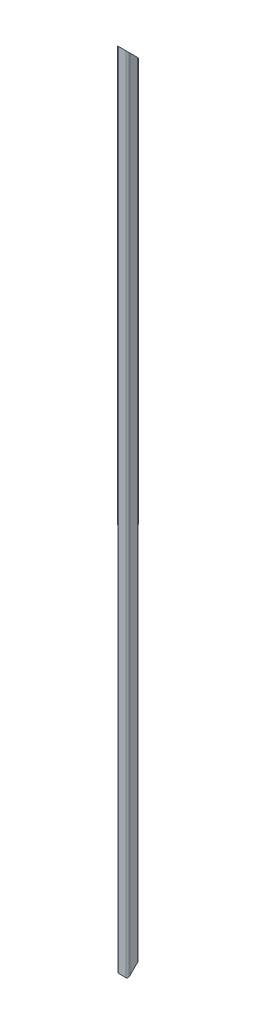
ISO-10303-21;
HEADER;
FILE_DESCRIPTION(('STEP AP214'),'2;1');
FILE_NAME('part.step','',(''),(''),'','','');
FILE_SCHEMA(('AUTOMOTIVE_DESIGN { 1 0 10303 214 1 1 1 1 }'));
ENDSEC;
DATA;
#1=APPLICATION_CONTEXT('core data for automotive mechanical design processes');
#2=APPLICATION_PROTOCOL_DEFINITION('international standard','automotive_design',2000,#1);
#3=PRODUCT_CONTEXT('',#1,'mechanical');
#4=PRODUCT('Part','Part','',(#3));
#5=PRODUCT_RELATED_PRODUCT_CATEGORY('part','',(#4));
#6=PRODUCT_DEFINITION_FORMATION('','',#4);
#7=PRODUCT_DEFINITION_CONTEXT('part definition',#1,'design');
#8=PRODUCT_DEFINITION('design','',#6,#7);
#9=PRODUCT_DEFINITION_SHAPE('','',#8);
#10=(LENGTH_UNIT() NAMED_UNIT(*) SI_UNIT(.MILLI.,.METRE.));
#11=(NAMED_UNIT(*) PLANE_ANGLE_UNIT() SI_UNIT($,.RADIAN.));
#12=(NAMED_UNIT(*) SI_UNIT($,.STERADIAN.) SOLID_ANGLE_UNIT());
#13=UNCERTAINTY_MEASURE_WITH_UNIT(LENGTH_MEASURE(1.E-05),#10,'distance_accuracy_value','');
#14=(GEOMETRIC_REPRESENTATION_CONTEXT(3) GLOBAL_UNCERTAINTY_ASSIGNED_CONTEXT((#13)) GLOBAL_UNIT_ASSIGNED_CONTEXT((#10,
#11,#12)) REPRESENTATION_CONTEXT('',''));
#15=CARTESIAN_POINT('',(0.,0.,0.));
#16=DIRECTION('',(0.,0.,1.));
#17=DIRECTION('',(1.,0.,0.));
#18=AXIS2_PLACEMENT_3D('',#15,#16,#17);
#19=CARTESIAN_POINT('',(-15.9999999999999,4240.,26.));
#20=DIRECTION('',(0.,0.,-1.));
#21=DIRECTION('',(-1.,0.,0.));
#22=AXIS2_PLACEMENT_3D('',#19,#20,#21);
#23=PLANE('',#22);
#24=DIRECTION('',(1.,0.,0.));
#25=VECTOR('',#24,1.);
#26=CARTESIAN_POINT('',(-16.0000000000007,3.99999999999956,26.));
#27=LINE('',#26,#25);
#28=CARTESIAN_POINT('',(-15.9999999999999,3.99999999999956,26.));
#29=VERTEX_POINT('',#28);
#30=CARTESIAN_POINT('',(15.9999999999999,3.99999999999955,26.));
#31=VERTEX_POINT('',#30);
#32=EDGE_CURVE('E11',#29,#31,#27,.T.);
#33=ORIENTED_EDGE('',*,*,#32,.F.);
#34=DIRECTION('',(0.,-1.,0.));
#35=VECTOR('',#34,1.);
#36=CARTESIAN_POINT('',(-15.9999999999999,4240.,26.));
#37=LINE('',#36,#35);
#38=CARTESIAN_POINT('',(-15.9999999999999,4236.,26.));
#39=VERTEX_POINT('',#38);
#40=EDGE_CURVE('E209',#39,#29,#37,.T.);
#41=ORIENTED_EDGE('',*,*,#40,.F.);
#42=DIRECTION('',(-1.,0.,0.));
#43=VECTOR('',#42,1.);
#44=CARTESIAN_POINT('',(-15.9999999999999,4236.,26.));
#45=LINE('',#44,#43);
#46=CARTESIAN_POINT('',(15.9999999999999,4236.,26.));
#47=VERTEX_POINT('',#46);
#48=EDGE_CURVE('E43',#47,#39,#45,.T.);
#49=ORIENTED_EDGE('',*,*,#48,.F.);
#50=DIRECTION('',(0.,-1.,0.));
#51=VECTOR('',#50,1.);
#52=CARTESIAN_POINT('',(15.9999999999999,4240.,26.));
#53=LINE('',#52,#51);
#54=EDGE_CURVE('E216',#47,#31,#53,.T.);
#55=ORIENTED_EDGE('',*,*,#54,.T.);
#56=EDGE_LOOP('',(#33,#41,#49,#55));
#57=FACE_BOUND('',#56,.T.);
#58=ADVANCED_FACE('F35',(#57),#23,.T.);
#59=CARTESIAN_POINT('',(-16.,4240.,16.));
#60=DIRECTION('',(0.,-1.,0.));
#61=DIRECTION('',(0.,0.,-1.));
#62=AXIS2_PLACEMENT_3D('',#59,#60,#61);
#63=CYLINDRICAL_SURFACE('',#62,10.);
#64=CARTESIAN_POINT('',(-16.,13.9999999999993,16.));
#65=DIRECTION('',(0.,0.707106781186544,0.707106781186551));
#66=DIRECTION('',(0.,-0.707106781186551,0.707106781186544));
#67=AXIS2_PLACEMENT_3D('',#64,#65,#66);
#68=ELLIPSE('',#67,14.142135623731,10.);
#69=CARTESIAN_POINT('',(-26.,13.9999999999993,15.9999999999999));
#70=VERTEX_POINT('',#69);
#71=EDGE_CURVE('E292',#70,#29,#68,.T.);
#72=ORIENTED_EDGE('',*,*,#71,.F.);
#73=DIRECTION('',(0.,-1.,0.));
#74=VECTOR('',#73,1.);
#75=CARTESIAN_POINT('',(-26.,4240.,15.9999999999999));
#76=LINE('',#75,#74);
#77=CARTESIAN_POINT('',(-26.,4226.,15.9999999999999));
#78=VERTEX_POINT('',#77);
#79=EDGE_CURVE('E211',#78,#70,#76,.T.);
#80=ORIENTED_EDGE('',*,*,#79,.F.);
#81=CARTESIAN_POINT('',(-16.,4226.,16.));
#82=DIRECTION('',(0.,-0.707106781186545,0.70710678118655));
#83=DIRECTION('',(0.,-0.70710678118655,-0.707106781186545));
#84=AXIS2_PLACEMENT_3D('',#81,#82,#83);
#85=ELLIPSE('',#84,14.142135623731,10.);
#86=EDGE_CURVE('E196',#39,#78,#85,.T.);
#87=ORIENTED_EDGE('',*,*,#86,.F.);
#88=ORIENTED_EDGE('',*,*,#40,.T.);
#89=EDGE_LOOP('',(#72,#80,#87,#88));
#90=FACE_BOUND('',#89,.T.);
#91=ADVANCED_FACE('F208',(#90),#63,.F.);
#92=CARTESIAN_POINT('',(-26.,4240.,-15.9999999999999));
#93=DIRECTION('',(1.,0.,0.));
#94=DIRECTION('',(0.,0.,-1.));
#95=AXIS2_PLACEMENT_3D('',#92,#93,#94);
#96=PLANE('',#95);
#97=DIRECTION('',(0.,-0.707106781186551,0.707106781186544));
#98=VECTOR('',#97,1.);
#99=CARTESIAN_POINT('',(-26.,2143.00000000002,-2113.));
#100=LINE('',#99,#98);
#101=CARTESIAN_POINT('',(-26.,46.0000000000007,-16.0000000000005));
#102=VERTEX_POINT('',#101);
#103=EDGE_CURVE('E294',#102,#70,#100,.T.);
#104=ORIENTED_EDGE('',*,*,#103,.F.);
#105=DIRECTION('',(0.,-1.,0.));
#106=VECTOR('',#105,1.);
#107=CARTESIAN_POINT('',(-26.,4240.,-15.9999999999999));
#108=LINE('',#107,#106);
#109=CARTESIAN_POINT('',(-26.,4194.,-15.9999999999999));
#110=VERTEX_POINT('',#109);
#111=EDGE_CURVE('E218',#110,#102,#108,.T.);
#112=ORIENTED_EDGE('',*,*,#111,.F.);
#113=DIRECTION('',(0.,-0.70710678118655,-0.707106781186545));
#114=VECTOR('',#113,1.);
#115=CARTESIAN_POINT('',(-26.,4217.,7.00000000000022));
#116=LINE('',#115,#114);
#117=EDGE_CURVE('E212',#78,#110,#116,.T.);
#118=ORIENTED_EDGE('',*,*,#117,.F.);
#119=ORIENTED_EDGE('',*,*,#79,.T.);
#120=EDGE_LOOP('',(#104,#112,#118,#119));
#121=FACE_BOUND('',#120,.T.);
#122=ADVANCED_FACE('F326',(#121),#96,.T.);
#123=CARTESIAN_POINT('',(-16.,4240.,-16.));
#124=DIRECTION('',(0.,-1.,0.));
#125=DIRECTION('',(0.,0.,-1.));
#126=AXIS2_PLACEMENT_3D('',#123,#124,#125);
#127=CYLINDRICAL_SURFACE('',#126,10.);
#128=CARTESIAN_POINT('',(-16.,46.0000000000003,-16.));
#129=DIRECTION('',(0.,0.707106781186544,0.707106781186551));
#130=DIRECTION('',(0.,-0.707106781186551,0.707106781186544));
#131=AXIS2_PLACEMENT_3D('',#128,#129,#130);
#132=ELLIPSE('',#131,14.142135623731,10.);
#133=CARTESIAN_POINT('',(-15.9999999999999,56.0000000000009,-26.));
#134=VERTEX_POINT('',#133);
#135=EDGE_CURVE('E296',#134,#102,#132,.T.);
#136=ORIENTED_EDGE('',*,*,#135,.F.);
#137=DIRECTION('',(0.,-1.,0.));
#138=VECTOR('',#137,1.);
#139=CARTESIAN_POINT('',(-15.9999999999999,4240.,-26.));
#140=LINE('',#139,#138);
#141=CARTESIAN_POINT('',(-15.9999999999999,4184.,-26.));
#142=VERTEX_POINT('',#141);
#143=EDGE_CURVE('E225',#142,#134,#140,.T.);
#144=ORIENTED_EDGE('',*,*,#143,.F.);
#145=CARTESIAN_POINT('',(-16.,4194.,-16.));
#146=DIRECTION('',(0.,-0.707106781186545,0.70710678118655));
#147=DIRECTION('',(0.,-0.70710678118655,-0.707106781186545));
#148=AXIS2_PLACEMENT_3D('',#145,#146,#147);
#149=ELLIPSE('',#148,14.142135623731,10.);
#150=EDGE_CURVE('E280',#110,#142,#149,.T.);
#151=ORIENTED_EDGE('',*,*,#150,.F.);
#152=ORIENTED_EDGE('',*,*,#111,.T.);
#153=EDGE_LOOP('',(#136,#144,#151,#152));
#154=FACE_BOUND('',#153,.T.);
#155=ADVANCED_FACE('F305',(#154),#127,.F.);
#156=CARTESIAN_POINT('',(-15.9999999999999,4240.,-26.));
#157=DIRECTION('',(0.,0.,1.));
#158=DIRECTION('',(1.,0.,0.));
#159=AXIS2_PLACEMENT_3D('',#156,#157,#158);
#160=PLANE('',#159);
#161=DIRECTION('',(-1.,0.,0.));
#162=VECTOR('',#161,1.);
#163=CARTESIAN_POINT('',(-16.0000000000007,56.,-26.));
#164=LINE('',#163,#162);
#165=CARTESIAN_POINT('',(15.9999999999999,56.,-26.));
#166=VERTEX_POINT('',#165);
#167=EDGE_CURVE('E251',#166,#134,#164,.T.);
#168=ORIENTED_EDGE('',*,*,#167,.F.);
#169=DIRECTION('',(0.,-1.,0.));
#170=VECTOR('',#169,1.);
#171=CARTESIAN_POINT('',(15.9999999999999,4240.,-26.));
#172=LINE('',#171,#170);
#173=CARTESIAN_POINT('',(15.9999999999999,4184.,-26.));
#174=VERTEX_POINT('',#173);
#175=EDGE_CURVE('E228',#174,#166,#172,.T.);
#176=ORIENTED_EDGE('',*,*,#175,.F.);
#177=DIRECTION('',(1.,0.,0.));
#178=VECTOR('',#177,1.);
#179=CARTESIAN_POINT('',(-15.9999999999999,4184.,-26.));
#180=LINE('',#179,#178);
#181=EDGE_CURVE('E282',#142,#174,#180,.T.);
#182=ORIENTED_EDGE('',*,*,#181,.F.);
#183=ORIENTED_EDGE('',*,*,#143,.T.);
#184=EDGE_LOOP('',(#168,#176,#182,#183));
#185=FACE_BOUND('',#184,.T.);
#186=ADVANCED_FACE('F309',(#185),#160,.T.);
#187=CARTESIAN_POINT('',(16.,4240.,-16.));
#188=DIRECTION('',(0.,-1.,0.));
#189=DIRECTION('',(0.,0.,-1.));
#190=AXIS2_PLACEMENT_3D('',#187,#188,#189);
#191=CYLINDRICAL_SURFACE('',#190,10.);
#192=CARTESIAN_POINT('',(16.,46.0000000000003,-16.));
#193=DIRECTION('',(0.,0.707106781186544,0.707106781186551));
#194=DIRECTION('',(0.,-0.707106781186551,0.707106781186544));
#195=AXIS2_PLACEMENT_3D('',#192,#193,#194);
#196=ELLIPSE('',#195,14.142135623731,10.);
#197=CARTESIAN_POINT('',(26.,46.0000000000003,-15.9999999999999));
#198=VERTEX_POINT('',#197);
#199=EDGE_CURVE('E247',#198,#166,#196,.T.);
#200=ORIENTED_EDGE('',*,*,#199,.F.);
#201=DIRECTION('',(0.,-1.,0.));
#202=VECTOR('',#201,1.);
#203=CARTESIAN_POINT('',(26.,4240.,-15.9999999999999));
#204=LINE('',#203,#202);
#205=CARTESIAN_POINT('',(26.,4194.,-15.9999999999999));
#206=VERTEX_POINT('',#205);
#207=EDGE_CURVE('E230',#206,#198,#204,.T.);
#208=ORIENTED_EDGE('',*,*,#207,.F.);
#209=CARTESIAN_POINT('',(16.,4194.,-16.));
#210=DIRECTION('',(0.,-0.707106781186545,0.70710678118655));
#211=DIRECTION('',(0.,-0.70710678118655,-0.707106781186545));
#212=AXIS2_PLACEMENT_3D('',#209,#210,#211);
#213=ELLIPSE('',#212,14.142135623731,10.);
#214=EDGE_CURVE('E284',#174,#206,#213,.T.);
#215=ORIENTED_EDGE('',*,*,#214,.F.);
#216=ORIENTED_EDGE('',*,*,#175,.T.);
#217=EDGE_LOOP('',(#200,#208,#215,#216));
#218=FACE_BOUND('',#217,.T.);
#219=ADVANCED_FACE('F312',(#218),#191,.F.);
#220=CARTESIAN_POINT('',(26.,4240.,-15.9999999999999));
#221=DIRECTION('',(-1.,0.,0.));
#222=DIRECTION('',(0.,0.,1.));
#223=AXIS2_PLACEMENT_3D('',#220,#221,#222);
#224=PLANE('',#223);
#225=DIRECTION('',(0.,0.707106781186551,-0.707106781186544));
#226=VECTOR('',#225,1.);
#227=CARTESIAN_POINT('',(26.,2143.00000000002,-2113.));
#228=LINE('',#227,#226);
#229=CARTESIAN_POINT('',(26.,14.0000000000002,15.9999999999996));
#230=VERTEX_POINT('',#229);
#231=EDGE_CURVE('E244',#230,#198,#228,.T.);
#232=ORIENTED_EDGE('',*,*,#231,.F.);
#233=DIRECTION('',(0.,-1.,0.));
#234=VECTOR('',#233,1.);
#235=CARTESIAN_POINT('',(26.,4240.,15.9999999999999));
#236=LINE('',#235,#234);
#237=CARTESIAN_POINT('',(26.,4226.,15.9999999999999));
#238=VERTEX_POINT('',#237);
#239=EDGE_CURVE('E176',#238,#230,#236,.T.);
#240=ORIENTED_EDGE('',*,*,#239,.F.);
#241=DIRECTION('',(0.,0.70710678118655,0.707106781186545));
#242=VECTOR('',#241,1.);
#243=CARTESIAN_POINT('',(26.,4217.,7.00000000000022));
#244=LINE('',#243,#242);
#245=EDGE_CURVE('E243',#206,#238,#244,.T.);
#246=ORIENTED_EDGE('',*,*,#245,.F.);
#247=ORIENTED_EDGE('',*,*,#207,.T.);
#248=EDGE_LOOP('',(#232,#240,#246,#247));
#249=FACE_BOUND('',#248,.T.);
#250=ADVANCED_FACE('F242',(#249),#224,.T.);
#251=CARTESIAN_POINT('',(16.,4240.,16.));
#252=DIRECTION('',(0.,-1.,0.));
#253=DIRECTION('',(0.,0.,-1.));
#254=AXIS2_PLACEMENT_3D('',#251,#252,#253);
#255=CYLINDRICAL_SURFACE('',#254,10.);
#256=CARTESIAN_POINT('',(16.,13.9999999999993,16.));
#257=DIRECTION('',(0.,0.707106781186544,0.707106781186551));
#258=DIRECTION('',(0.,-0.707106781186551,0.707106781186544));
#259=AXIS2_PLACEMENT_3D('',#256,#257,#258);
#260=ELLIPSE('',#259,14.142135623731,10.);
#261=EDGE_CURVE('E241',#31,#230,#260,.T.);
#262=ORIENTED_EDGE('',*,*,#261,.F.);
#263=ORIENTED_EDGE('',*,*,#54,.F.);
#264=CARTESIAN_POINT('',(16.,4226.,16.));
#265=DIRECTION('',(0.,-0.707106781186545,0.70710678118655));
#266=DIRECTION('',(0.,-0.70710678118655,-0.707106781186545));
#267=AXIS2_PLACEMENT_3D('',#264,#265,#266);
#268=ELLIPSE('',#267,14.142135623731,10.);
#269=EDGE_CURVE('E199',#238,#47,#268,.T.);
#270=ORIENTED_EDGE('',*,*,#269,.F.);
#271=ORIENTED_EDGE('',*,*,#239,.T.);
#272=EDGE_LOOP('',(#262,#263,#270,#271));
#273=FACE_BOUND('',#272,.T.);
#274=ADVANCED_FACE('F240',(#273),#255,.F.);
#275=CARTESIAN_POINT('',(-30.,4180.,-30.));
#276=DIRECTION('',(0.,-0.707106781186545,0.70710678118655));
#277=DIRECTION('',(0.,-0.70710678118655,-0.707106781186545));
#278=AXIS2_PLACEMENT_3D('',#275,#276,#277);
#279=PLANE('',#278);
#280=ORIENTED_EDGE('',*,*,#269,.T.);
#281=ORIENTED_EDGE('',*,*,#48,.T.);
#282=ORIENTED_EDGE('',*,*,#86,.T.);
#283=ORIENTED_EDGE('',*,*,#117,.T.);
#284=ORIENTED_EDGE('',*,*,#150,.T.);
#285=ORIENTED_EDGE('',*,*,#181,.T.);
#286=ORIENTED_EDGE('',*,*,#214,.T.);
#287=ORIENTED_EDGE('',*,*,#245,.T.);
#288=EDGE_LOOP('',(#280,#281,#282,#283,#284,#285,#286,#287));
#289=FACE_BOUND('',#288,.T.);
#290=DIRECTION('',(1.,0.,0.));
#291=VECTOR('',#290,1.);
#292=CARTESIAN_POINT('',(-30.,4180.,-30.));
#293=LINE('',#292,#291);
#294=CARTESIAN_POINT('',(-20.,4180.,-30.));
#295=VERTEX_POINT('',#294);
#296=CARTESIAN_POINT('',(19.9999999999999,4180.,-30.));
#297=VERTEX_POINT('',#296);
#298=EDGE_CURVE('E269',#295,#297,#293,.T.);
#299=ORIENTED_EDGE('',*,*,#298,.F.);
#300=CARTESIAN_POINT('',(-20.,4190.,-20.));
#301=DIRECTION('',(0.,-0.707106781186545,0.70710678118655));
#302=DIRECTION('',(0.,-0.70710678118655,-0.707106781186545));
#303=AXIS2_PLACEMENT_3D('',#300,#301,#302);
#304=ELLIPSE('',#303,14.142135623731,10.);
#305=CARTESIAN_POINT('',(-30.,4190.,-20.0000000000001));
#306=VERTEX_POINT('',#305);
#307=EDGE_CURVE('E155',#306,#295,#304,.T.);
#308=ORIENTED_EDGE('',*,*,#307,.F.);
#309=DIRECTION('',(0.,-0.70710678118655,-0.707106781186545));
#310=VECTOR('',#309,1.);
#311=CARTESIAN_POINT('',(-30.,4180.,-30.));
#312=LINE('',#311,#310);
#313=CARTESIAN_POINT('',(-30.,4230.,20.));
#314=VERTEX_POINT('',#313);
#315=EDGE_CURVE('E151',#314,#306,#312,.T.);
#316=ORIENTED_EDGE('',*,*,#315,.F.);
#317=CARTESIAN_POINT('',(-20.,4230.,20.));
#318=DIRECTION('',(0.,-0.707106781186545,0.70710678118655));
#319=DIRECTION('',(0.,-0.70710678118655,-0.707106781186545));
#320=AXIS2_PLACEMENT_3D('',#317,#318,#319);
#321=ELLIPSE('',#320,14.142135623731,10.);
#322=CARTESIAN_POINT('',(-20.,4240.,30.));
#323=VERTEX_POINT('',#322);
#324=EDGE_CURVE('E145',#323,#314,#321,.T.);
#325=ORIENTED_EDGE('',*,*,#324,.F.);
#326=DIRECTION('',(1.,0.,0.));
#327=VECTOR('',#326,1.);
#328=CARTESIAN_POINT('',(-19.9999999999999,4240.,30.));
#329=LINE('',#328,#327);
#330=CARTESIAN_POINT('',(20.,4240.,30.));
#331=VERTEX_POINT('',#330);
#332=EDGE_CURVE('E149',#323,#331,#329,.T.);
#333=ORIENTED_EDGE('',*,*,#332,.T.);
#334=CARTESIAN_POINT('',(20.,4230.,20.));
#335=DIRECTION('',(0.,-0.707106781186545,0.70710678118655));
#336=DIRECTION('',(0.,-0.70710678118655,-0.707106781186545));
#337=AXIS2_PLACEMENT_3D('',#334,#335,#336);
#338=ELLIPSE('',#337,14.142135623731,10.);
#339=CARTESIAN_POINT('',(30.,4230.,19.9999999999999));
#340=VERTEX_POINT('',#339);
#341=EDGE_CURVE('E50',#340,#331,#338,.T.);
#342=ORIENTED_EDGE('',*,*,#341,.F.);
#343=DIRECTION('',(0.,-0.70710678118655,-0.707106781186545));
#344=VECTOR('',#343,1.);
#345=CARTESIAN_POINT('',(30.,4180.,-30.));
#346=LINE('',#345,#344);
#347=CARTESIAN_POINT('',(30.,4190.,-20.0000000000001));
#348=VERTEX_POINT('',#347);
#349=EDGE_CURVE('E275',#340,#348,#346,.T.);
#350=ORIENTED_EDGE('',*,*,#349,.T.);
#351=CARTESIAN_POINT('',(20.,4190.,-20.));
#352=DIRECTION('',(0.,-0.707106781186545,0.70710678118655));
#353=DIRECTION('',(0.,-0.70710678118655,-0.707106781186545));
#354=AXIS2_PLACEMENT_3D('',#351,#352,#353);
#355=ELLIPSE('',#354,14.142135623731,10.);
#356=EDGE_CURVE('E290',#297,#348,#355,.T.);
#357=ORIENTED_EDGE('',*,*,#356,.F.);
#358=EDGE_LOOP('',(#299,#308,#316,#325,#333,#342,#350,#357));
#359=FACE_BOUND('',#358,.T.);
#360=ADVANCED_FACE('F147',(#289,#359),#279,.F.);
#361=CARTESIAN_POINT('',(-30.,60.0000000000007,-30.));
#362=DIRECTION('',(0.,0.707106781186544,0.707106781186551));
#363=DIRECTION('',(0.,-0.707106781186551,0.707106781186544));
#364=AXIS2_PLACEMENT_3D('',#361,#362,#363);
#365=PLANE('',#364);
#366=ORIENTED_EDGE('',*,*,#261,.T.);
#367=ORIENTED_EDGE('',*,*,#231,.T.);
#368=ORIENTED_EDGE('',*,*,#199,.T.);
#369=ORIENTED_EDGE('',*,*,#167,.T.);
#370=ORIENTED_EDGE('',*,*,#135,.T.);
#371=ORIENTED_EDGE('',*,*,#103,.T.);
#372=ORIENTED_EDGE('',*,*,#71,.T.);
#373=ORIENTED_EDGE('',*,*,#32,.T.);
#374=EDGE_LOOP('',(#366,#367,#368,#369,#370,#371,#372,#373));
#375=FACE_BOUND('',#374,.T.);
#376=DIRECTION('',(0.,-0.707106781186551,0.707106781186543));
#377=VECTOR('',#376,1.);
#378=CARTESIAN_POINT('',(30.,60.0000000000007,-30.));
#379=LINE('',#378,#377);
#380=CARTESIAN_POINT('',(30.,50.,-20.));
#381=VERTEX_POINT('',#380);
#382=CARTESIAN_POINT('',(30.,10.0000000000002,19.9999999999999));
#383=VERTEX_POINT('',#382);
#384=EDGE_CURVE('E271',#381,#383,#379,.T.);
#385=ORIENTED_EDGE('',*,*,#384,.T.);
#386=CARTESIAN_POINT('',(20.,9.99999999999979,20.));
#387=DIRECTION('',(0.,0.707106781186544,0.707106781186551));
#388=DIRECTION('',(0.,-0.707106781186551,0.707106781186544));
#389=AXIS2_PLACEMENT_3D('',#386,#387,#388);
#390=ELLIPSE('',#389,14.142135623731,10.);
#391=CARTESIAN_POINT('',(20.,0.,30.));
#392=VERTEX_POINT('',#391);
#393=EDGE_CURVE('E249',#392,#383,#390,.T.);
#394=ORIENTED_EDGE('',*,*,#393,.F.);
#395=DIRECTION('',(1.,0.,0.));
#396=VECTOR('',#395,1.);
#397=CARTESIAN_POINT('',(-19.9999999999999,0.,30.));
#398=LINE('',#397,#396);
#399=CARTESIAN_POINT('',(-20.,0.,30.));
#400=VERTEX_POINT('',#399);
#401=EDGE_CURVE('E171',#400,#392,#398,.T.);
#402=ORIENTED_EDGE('',*,*,#401,.F.);
#403=CARTESIAN_POINT('',(-20.,9.99999999999979,20.));
#404=DIRECTION('',(0.,0.707106781186544,0.707106781186551));
#405=DIRECTION('',(0.,-0.707106781186551,0.707106781186544));
#406=AXIS2_PLACEMENT_3D('',#403,#404,#405);
#407=ELLIPSE('',#406,14.142135623731,10.);
#408=CARTESIAN_POINT('',(-30.,9.99999999999987,20.0000000000001));
#409=VERTEX_POINT('',#408);
#410=EDGE_CURVE('E161',#409,#400,#407,.T.);
#411=ORIENTED_EDGE('',*,*,#410,.F.);
#412=DIRECTION('',(0.,-0.707106781186551,0.707106781186543));
#413=VECTOR('',#412,1.);
#414=CARTESIAN_POINT('',(-30.,60.0000000000007,-30.));
#415=LINE('',#414,#413);
#416=CARTESIAN_POINT('',(-30.,50.0000000000004,-19.9999999999999));
#417=VERTEX_POINT('',#416);
#418=EDGE_CURVE('E273',#417,#409,#415,.T.);
#419=ORIENTED_EDGE('',*,*,#418,.F.);
#420=CARTESIAN_POINT('',(-20.,49.9999999999998,-20.));
#421=DIRECTION('',(0.,0.707106781186544,0.707106781186551));
#422=DIRECTION('',(0.,-0.707106781186551,0.707106781186544));
#423=AXIS2_PLACEMENT_3D('',#420,#421,#422);
#424=ELLIPSE('',#423,14.142135623731,10.);
#425=CARTESIAN_POINT('',(-20.,60.0000000000007,-30.));
#426=VERTEX_POINT('',#425);
#427=EDGE_CURVE('E258',#426,#417,#424,.T.);
#428=ORIENTED_EDGE('',*,*,#427,.F.);
#429=DIRECTION('',(1.,0.,0.));
#430=VECTOR('',#429,1.);
#431=CARTESIAN_POINT('',(-30.,60.0000000000007,-30.));
#432=LINE('',#431,#430);
#433=CARTESIAN_POINT('',(19.9999999999999,60.0000000000007,-30.));
#434=VERTEX_POINT('',#433);
#435=EDGE_CURVE('E213',#426,#434,#432,.T.);
#436=ORIENTED_EDGE('',*,*,#435,.T.);
#437=CARTESIAN_POINT('',(20.,49.9999999999998,-20.));
#438=DIRECTION('',(0.,0.707106781186544,0.707106781186551));
#439=DIRECTION('',(0.,-0.707106781186551,0.707106781186544));
#440=AXIS2_PLACEMENT_3D('',#437,#438,#439);
#441=ELLIPSE('',#440,14.142135623731,10.);
#442=EDGE_CURVE('E58',#381,#434,#441,.T.);
#443=ORIENTED_EDGE('',*,*,#442,.F.);
#444=EDGE_LOOP('',(#385,#394,#402,#411,#419,#428,#436,#443));
#445=FACE_BOUND('',#444,.T.);
#446=ADVANCED_FACE('F299',(#375,#445),#365,.F.);
#447=CARTESIAN_POINT('',(20.,4240.,-20.));
#448=DIRECTION('',(0.,-1.,0.));
#449=DIRECTION('',(0.,0.,-1.));
#450=AXIS2_PLACEMENT_3D('',#447,#448,#449);
#451=CYLINDRICAL_SURFACE('',#450,10.);
#452=DIRECTION('',(0.,-1.,0.));
#453=VECTOR('',#452,1.);
#454=CARTESIAN_POINT('',(30.,4240.,-19.9999999999999));
#455=LINE('',#454,#453);
#456=EDGE_CURVE('E170',#348,#381,#455,.T.);
#457=ORIENTED_EDGE('',*,*,#456,.T.);
#458=ORIENTED_EDGE('',*,*,#442,.T.);
#459=DIRECTION('',(0.,-1.,0.));
#460=VECTOR('',#459,1.);
#461=CARTESIAN_POINT('',(19.9999999999999,4240.,-30.));
#462=LINE('',#461,#460);
#463=EDGE_CURVE('E191',#297,#434,#462,.T.);
#464=ORIENTED_EDGE('',*,*,#463,.F.);
#465=ORIENTED_EDGE('',*,*,#356,.T.);
#466=EDGE_LOOP('',(#457,#458,#464,#465));
#467=FACE_BOUND('',#466,.T.);
#468=ADVANCED_FACE('F37',(#467),#451,.T.);
#469=CARTESIAN_POINT('',(-19.9999999999999,4240.,-30.));
#470=DIRECTION('',(0.,0.,1.));
#471=DIRECTION('',(1.,0.,0.));
#472=AXIS2_PLACEMENT_3D('',#469,#470,#471);
#473=PLANE('',#472);
#474=ORIENTED_EDGE('',*,*,#463,.T.);
#475=ORIENTED_EDGE('',*,*,#435,.F.);
#476=DIRECTION('',(0.,-1.,0.));
#477=VECTOR('',#476,1.);
#478=CARTESIAN_POINT('',(-19.9999999999999,4240.,-30.));
#479=LINE('',#478,#477);
#480=EDGE_CURVE('E188',#295,#426,#479,.T.);
#481=ORIENTED_EDGE('',*,*,#480,.F.);
#482=ORIENTED_EDGE('',*,*,#298,.T.);
#483=EDGE_LOOP('',(#474,#475,#481,#482));
#484=FACE_BOUND('',#483,.T.);
#485=ADVANCED_FACE('F267',(#484),#473,.F.);
#486=CARTESIAN_POINT('',(-20.,4240.,-20.));
#487=DIRECTION('',(0.,-1.,0.));
#488=DIRECTION('',(0.,0.,-1.));
#489=AXIS2_PLACEMENT_3D('',#486,#487,#488);
#490=CYLINDRICAL_SURFACE('',#489,10.);
#491=ORIENTED_EDGE('',*,*,#480,.T.);
#492=ORIENTED_EDGE('',*,*,#427,.T.);
#493=DIRECTION('',(0.,-1.,0.));
#494=VECTOR('',#493,1.);
#495=CARTESIAN_POINT('',(-30.,4240.,-19.9999999999999));
#496=LINE('',#495,#494);
#497=EDGE_CURVE('E185',#306,#417,#496,.T.);
#498=ORIENTED_EDGE('',*,*,#497,.F.);
#499=ORIENTED_EDGE('',*,*,#307,.T.);
#500=EDGE_LOOP('',(#491,#492,#498,#499));
#501=FACE_BOUND('',#500,.T.);
#502=ADVANCED_FACE('F393',(#501),#490,.T.);
#503=CARTESIAN_POINT('',(-30.,4240.,-19.9999999999999));
#504=DIRECTION('',(1.,0.,0.));
#505=DIRECTION('',(0.,0.,-1.));
#506=AXIS2_PLACEMENT_3D('',#503,#504,#505);
#507=PLANE('',#506);
#508=ORIENTED_EDGE('',*,*,#497,.T.);
#509=ORIENTED_EDGE('',*,*,#418,.T.);
#510=DIRECTION('',(0.,-1.,0.));
#511=VECTOR('',#510,1.);
#512=CARTESIAN_POINT('',(-30.,4240.,19.9999999999999));
#513=LINE('',#512,#511);
#514=EDGE_CURVE('E164',#314,#409,#513,.T.);
#515=ORIENTED_EDGE('',*,*,#514,.F.);
#516=ORIENTED_EDGE('',*,*,#315,.T.);
#517=EDGE_LOOP('',(#508,#509,#515,#516));
#518=FACE_BOUND('',#517,.T.);
#519=ADVANCED_FACE('F401',(#518),#507,.F.);
#520=CARTESIAN_POINT('',(-20.,4240.,20.));
#521=DIRECTION('',(0.,-1.,0.));
#522=DIRECTION('',(0.,0.,-1.));
#523=AXIS2_PLACEMENT_3D('',#520,#521,#522);
#524=CYLINDRICAL_SURFACE('',#523,10.);
#525=ORIENTED_EDGE('',*,*,#514,.T.);
#526=ORIENTED_EDGE('',*,*,#410,.T.);
#527=DIRECTION('',(0.,-1.,0.));
#528=VECTOR('',#527,1.);
#529=CARTESIAN_POINT('',(-20.,4240.,30.));
#530=LINE('',#529,#528);
#531=EDGE_CURVE('E159',#323,#400,#530,.T.);
#532=ORIENTED_EDGE('',*,*,#531,.F.);
#533=ORIENTED_EDGE('',*,*,#324,.T.);
#534=EDGE_LOOP('',(#525,#526,#532,#533));
#535=FACE_BOUND('',#534,.T.);
#536=ADVANCED_FACE('F160',(#535),#524,.T.);
#537=CARTESIAN_POINT('',(-19.9999999999999,4240.,30.));
#538=DIRECTION('',(0.,0.,-1.));
#539=DIRECTION('',(-1.,0.,0.));
#540=AXIS2_PLACEMENT_3D('',#537,#538,#539);
#541=PLANE('',#540);
#542=ORIENTED_EDGE('',*,*,#401,.T.);
#543=DIRECTION('',(0.,-1.,0.));
#544=VECTOR('',#543,1.);
#545=CARTESIAN_POINT('',(19.9999999999999,4240.,30.));
#546=LINE('',#545,#544);
#547=EDGE_CURVE('E165',#331,#392,#546,.T.);
#548=ORIENTED_EDGE('',*,*,#547,.F.);
#549=ORIENTED_EDGE('',*,*,#332,.F.);
#550=ORIENTED_EDGE('',*,*,#531,.T.);
#551=EDGE_LOOP('',(#542,#548,#549,#550));
#552=FACE_BOUND('',#551,.T.);
#553=ADVANCED_FACE('F168',(#552),#541,.F.);
#554=CARTESIAN_POINT('',(20.,4240.,20.));
#555=DIRECTION('',(0.,-1.,0.));
#556=DIRECTION('',(0.,0.,-1.));
#557=AXIS2_PLACEMENT_3D('',#554,#555,#556);
#558=CYLINDRICAL_SURFACE('',#557,10.);
#559=ORIENTED_EDGE('',*,*,#547,.T.);
#560=ORIENTED_EDGE('',*,*,#393,.T.);
#561=DIRECTION('',(0.,-1.,0.));
#562=VECTOR('',#561,1.);
#563=CARTESIAN_POINT('',(30.,4240.,19.9999999999999));
#564=LINE('',#563,#562);
#565=EDGE_CURVE('E174',#340,#383,#564,.T.);
#566=ORIENTED_EDGE('',*,*,#565,.F.);
#567=ORIENTED_EDGE('',*,*,#341,.T.);
#568=EDGE_LOOP('',(#559,#560,#566,#567));
#569=FACE_BOUND('',#568,.T.);
#570=ADVANCED_FACE('F428',(#569),#558,.T.);
#571=CARTESIAN_POINT('',(30.,4240.,-19.9999999999999));
#572=DIRECTION('',(-1.,0.,0.));
#573=DIRECTION('',(0.,0.,1.));
#574=AXIS2_PLACEMENT_3D('',#571,#572,#573);
#575=PLANE('',#574);
#576=ORIENTED_EDGE('',*,*,#565,.T.);
#577=ORIENTED_EDGE('',*,*,#384,.F.);
#578=ORIENTED_EDGE('',*,*,#456,.F.);
#579=ORIENTED_EDGE('',*,*,#349,.F.);
#580=EDGE_LOOP('',(#576,#577,#578,#579));
#581=FACE_BOUND('',#580,.T.);
#582=ADVANCED_FACE('F437',(#581),#575,.F.);
#583=CLOSED_SHELL('',(#58,#91,#122,#155,#186,#219,#250,#274,#360,#446,#468,#485,#502,#519,#536,
#553,#570,#582));
#584=MANIFOLD_SOLID_BREP('B2',#583);
#585=ADVANCED_BREP_SHAPE_REPRESENTATION('',(#18,#584),#14);
#586=SHAPE_DEFINITION_REPRESENTATION(#9,#585);
ENDSEC;
END-ISO-10303-21;
